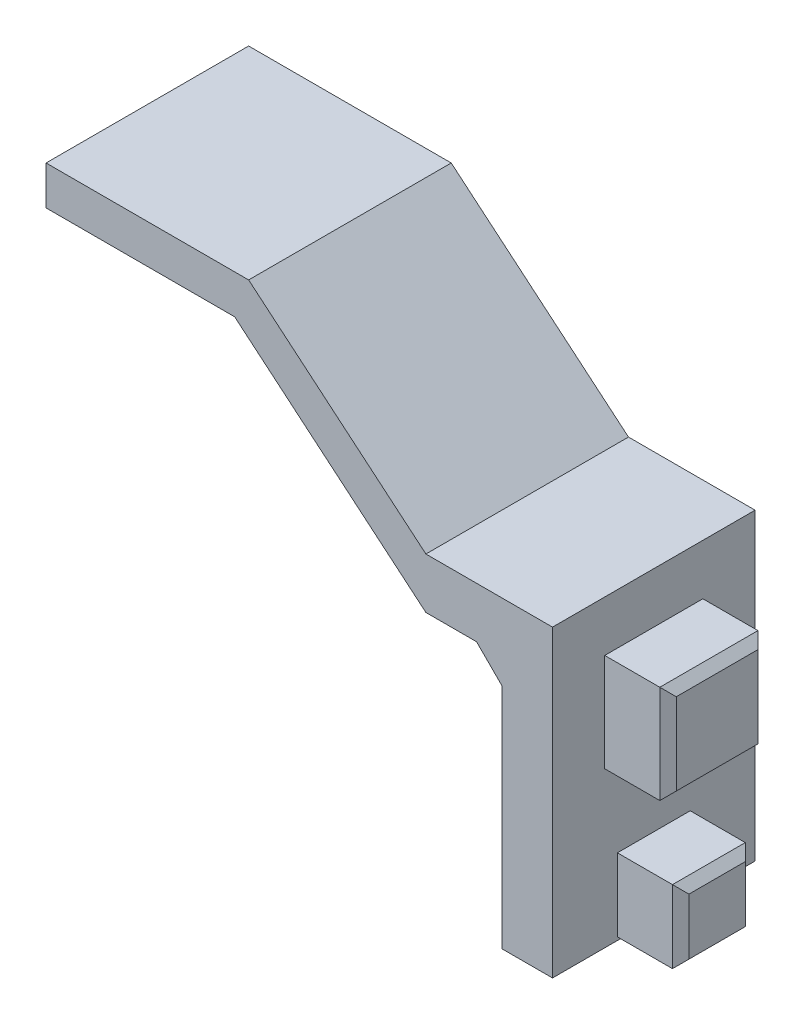
ISO-10303-21;
HEADER;
FILE_DESCRIPTION(('STEP AP214'),'2;1');
FILE_NAME('part.step','',(''),(''),'','','');
FILE_SCHEMA(('AUTOMOTIVE_DESIGN { 1 0 10303 214 1 1 1 1 }'));
ENDSEC;
DATA;
#1=APPLICATION_CONTEXT('core data for automotive mechanical design processes');
#2=APPLICATION_PROTOCOL_DEFINITION('international standard','automotive_design',2000,#1);
#3=PRODUCT_CONTEXT('',#1,'mechanical');
#4=PRODUCT('Part','Part','',(#3));
#5=PRODUCT_RELATED_PRODUCT_CATEGORY('part','',(#4));
#6=PRODUCT_DEFINITION_FORMATION('','',#4);
#7=PRODUCT_DEFINITION_CONTEXT('part definition',#1,'design');
#8=PRODUCT_DEFINITION('design','',#6,#7);
#9=PRODUCT_DEFINITION_SHAPE('','',#8);
#10=(LENGTH_UNIT() NAMED_UNIT(*) SI_UNIT(.MILLI.,.METRE.));
#11=(NAMED_UNIT(*) PLANE_ANGLE_UNIT() SI_UNIT($,.RADIAN.));
#12=(NAMED_UNIT(*) SI_UNIT($,.STERADIAN.) SOLID_ANGLE_UNIT());
#13=UNCERTAINTY_MEASURE_WITH_UNIT(LENGTH_MEASURE(1.E-05),#10,'distance_accuracy_value','');
#14=(GEOMETRIC_REPRESENTATION_CONTEXT(3) GLOBAL_UNCERTAINTY_ASSIGNED_CONTEXT((#13)) GLOBAL_UNIT_ASSIGNED_CONTEXT((#10,
#11,#12)) REPRESENTATION_CONTEXT('',''));
#15=CARTESIAN_POINT('',(0.,0.,0.));
#16=DIRECTION('',(0.,0.,1.));
#17=DIRECTION('',(1.,0.,0.));
#18=AXIS2_PLACEMENT_3D('',#15,#16,#17);
#19=CARTESIAN_POINT('',(0.,9.99999999999999,-4.));
#20=DIRECTION('',(0.,-1.,0.));
#21=DIRECTION('',(1.,0.,0.));
#22=AXIS2_PLACEMENT_3D('',#19,#20,#21);
#23=PLANE('',#22);
#24=DIRECTION('',(1.,0.,0.));
#25=VECTOR('',#24,1.);
#26=CARTESIAN_POINT('',(0.,9.99999999999999,4.));
#27=LINE('',#26,#25);
#28=CARTESIAN_POINT('',(-5.,10.,4.));
#29=VERTEX_POINT('',#28);
#30=CARTESIAN_POINT('',(-3.,10.,4.));
#31=VERTEX_POINT('',#30);
#32=EDGE_CURVE('E252',#29,#31,#27,.T.);
#33=ORIENTED_EDGE('',*,*,#32,.F.);
#34=DIRECTION('',(0.,0.,1.));
#35=VECTOR('',#34,1.);
#36=CARTESIAN_POINT('',(-5.,10.,-4.));
#37=LINE('',#36,#35);
#38=CARTESIAN_POINT('',(-5.,10.,-4.));
#39=VERTEX_POINT('',#38);
#40=EDGE_CURVE('E319',#39,#29,#37,.T.);
#41=ORIENTED_EDGE('',*,*,#40,.F.);
#42=DIRECTION('',(1.,0.,0.));
#43=VECTOR('',#42,1.);
#44=CARTESIAN_POINT('',(0.,9.99999999999999,-4.));
#45=LINE('',#44,#43);
#46=CARTESIAN_POINT('',(-3.,10.,-4.));
#47=VERTEX_POINT('',#46);
#48=EDGE_CURVE('E253',#39,#47,#45,.T.);
#49=ORIENTED_EDGE('',*,*,#48,.T.);
#50=DIRECTION('',(0.,0.,1.));
#51=VECTOR('',#50,1.);
#52=CARTESIAN_POINT('',(-3.,10.,-4.));
#53=LINE('',#52,#51);
#54=EDGE_CURVE('E287',#47,#31,#53,.T.);
#55=ORIENTED_EDGE('',*,*,#54,.T.);
#56=EDGE_LOOP('',(#33,#41,#49,#55));
#57=FACE_BOUND('',#56,.T.);
#58=ADVANCED_FACE('F38',(#57),#23,.T.);
#59=CARTESIAN_POINT('',(2.85815920922836,3.40622150580412,-4.));
#60=DIRECTION('',(-0.64278760968654,-0.766044443118977,0.));
#61=DIRECTION('',(0.766044443118977,-0.64278760968654,0.));
#62=AXIS2_PLACEMENT_3D('',#59,#60,#61);
#63=PLANE('',#62);
#64=DIRECTION('',(0.766044443118977,-0.64278760968654,0.));
#65=VECTOR('',#64,1.);
#66=CARTESIAN_POINT('',(2.85815920922836,3.40622150580412,4.));
#67=LINE('',#66,#65);
#68=CARTESIAN_POINT('',(-12.5507571417772,16.3358375327745,4.));
#69=VERTEX_POINT('',#68);
#70=EDGE_CURVE('E257',#69,#29,#67,.T.);
#71=ORIENTED_EDGE('',*,*,#70,.F.);
#72=DIRECTION('',(0.,0.,1.));
#73=VECTOR('',#72,1.);
#74=CARTESIAN_POINT('',(-12.5507571417772,16.3358375327745,-4.));
#75=LINE('',#74,#73);
#76=CARTESIAN_POINT('',(-12.5507571417772,16.3358375327745,-4.));
#77=VERTEX_POINT('',#76);
#78=EDGE_CURVE('E322',#77,#69,#75,.T.);
#79=ORIENTED_EDGE('',*,*,#78,.F.);
#80=DIRECTION('',(0.766044443118977,-0.64278760968654,0.));
#81=VECTOR('',#80,1.);
#82=CARTESIAN_POINT('',(2.85815920922836,3.40622150580412,-4.));
#83=LINE('',#82,#81);
#84=EDGE_CURVE('E284',#77,#39,#83,.T.);
#85=ORIENTED_EDGE('',*,*,#84,.T.);
#86=ORIENTED_EDGE('',*,*,#40,.T.);
#87=EDGE_LOOP('',(#71,#79,#85,#86));
#88=FACE_BOUND('',#87,.T.);
#89=ADVANCED_FACE('F424',(#88),#63,.T.);
#90=CARTESIAN_POINT('',(0.,16.3358375327745,-4.));
#91=DIRECTION('',(0.,-1.,0.));
#92=DIRECTION('',(1.,0.,0.));
#93=AXIS2_PLACEMENT_3D('',#90,#91,#92);
#94=PLANE('',#93);
#95=DIRECTION('',(1.,0.,0.));
#96=VECTOR('',#95,1.);
#97=CARTESIAN_POINT('',(0.,16.3358375327745,4.));
#98=LINE('',#97,#96);
#99=CARTESIAN_POINT('',(-20.,16.3358375327745,4.));
#100=VERTEX_POINT('',#99);
#101=EDGE_CURVE('E314',#100,#69,#98,.T.);
#102=ORIENTED_EDGE('',*,*,#101,.F.);
#103=DIRECTION('',(0.,0.,1.));
#104=VECTOR('',#103,1.);
#105=CARTESIAN_POINT('',(-20.,16.3358375327745,-4.));
#106=LINE('',#105,#104);
#107=CARTESIAN_POINT('',(-20.,16.3358375327745,-4.));
#108=VERTEX_POINT('',#107);
#109=EDGE_CURVE('E324',#108,#100,#106,.T.);
#110=ORIENTED_EDGE('',*,*,#109,.F.);
#111=DIRECTION('',(1.,0.,0.));
#112=VECTOR('',#111,1.);
#113=CARTESIAN_POINT('',(0.,16.3358375327745,-4.));
#114=LINE('',#113,#112);
#115=EDGE_CURVE('E281',#108,#77,#114,.T.);
#116=ORIENTED_EDGE('',*,*,#115,.T.);
#117=ORIENTED_EDGE('',*,*,#78,.T.);
#118=EDGE_LOOP('',(#102,#110,#116,#117));
#119=FACE_BOUND('',#118,.T.);
#120=ADVANCED_FACE('F430',(#119),#94,.T.);
#121=CARTESIAN_POINT('',(-20.,0.,-4.));
#122=DIRECTION('',(-1.,0.,0.));
#123=DIRECTION('',(0.,-1.,0.));
#124=AXIS2_PLACEMENT_3D('',#121,#122,#123);
#125=PLANE('',#124);
#126=DIRECTION('',(0.,-1.,0.));
#127=VECTOR('',#126,1.);
#128=CARTESIAN_POINT('',(-20.,0.,4.));
#129=LINE('',#128,#127);
#130=CARTESIAN_POINT('',(-20.,17.873697418241,4.));
#131=VERTEX_POINT('',#130);
#132=EDGE_CURVE('E311',#131,#100,#129,.T.);
#133=ORIENTED_EDGE('',*,*,#132,.F.);
#134=DIRECTION('',(0.,0.,1.));
#135=VECTOR('',#134,1.);
#136=CARTESIAN_POINT('',(-20.,17.873697418241,-4.));
#137=LINE('',#136,#135);
#138=CARTESIAN_POINT('',(-20.,17.873697418241,-4.));
#139=VERTEX_POINT('',#138);
#140=EDGE_CURVE('E326',#139,#131,#137,.T.);
#141=ORIENTED_EDGE('',*,*,#140,.F.);
#142=DIRECTION('',(0.,-1.,0.));
#143=VECTOR('',#142,1.);
#144=CARTESIAN_POINT('',(-20.,0.,-4.));
#145=LINE('',#144,#143);
#146=EDGE_CURVE('E278',#139,#108,#145,.T.);
#147=ORIENTED_EDGE('',*,*,#146,.T.);
#148=ORIENTED_EDGE('',*,*,#109,.T.);
#149=EDGE_LOOP('',(#133,#141,#147,#148));
#150=FACE_BOUND('',#149,.T.);
#151=ADVANCED_FACE('F648',(#150),#125,.T.);
#152=CARTESIAN_POINT('',(0.,17.873697418241,-4.));
#153=DIRECTION('',(0.,1.,0.));
#154=DIRECTION('',(0.,0.,1.));
#155=AXIS2_PLACEMENT_3D('',#152,#153,#154);
#156=PLANE('',#155);
#157=DIRECTION('',(-1.,0.,0.));
#158=VECTOR('',#157,1.);
#159=CARTESIAN_POINT('',(0.,17.873697418241,4.));
#160=LINE('',#159,#158);
#161=CARTESIAN_POINT('',(-12.,17.873697418241,4.));
#162=VERTEX_POINT('',#161);
#163=EDGE_CURVE('E308',#162,#131,#160,.T.);
#164=ORIENTED_EDGE('',*,*,#163,.F.);
#165=DIRECTION('',(0.,0.,1.));
#166=VECTOR('',#165,1.);
#167=CARTESIAN_POINT('',(-12.,17.873697418241,-4.));
#168=LINE('',#167,#166);
#169=CARTESIAN_POINT('',(-12.,17.873697418241,-4.));
#170=VERTEX_POINT('',#169);
#171=EDGE_CURVE('E328',#170,#162,#168,.T.);
#172=ORIENTED_EDGE('',*,*,#171,.F.);
#173=DIRECTION('',(-1.,0.,0.));
#174=VECTOR('',#173,1.);
#175=CARTESIAN_POINT('',(0.,17.873697418241,-4.));
#176=LINE('',#175,#174);
#177=EDGE_CURVE('E275',#170,#139,#176,.T.);
#178=ORIENTED_EDGE('',*,*,#177,.T.);
#179=ORIENTED_EDGE('',*,*,#140,.T.);
#180=EDGE_LOOP('',(#164,#172,#178,#179));
#181=FACE_BOUND('',#180,.T.);
#182=ADVANCED_FACE('F638',(#181),#156,.T.);
#183=CARTESIAN_POINT('',(3.84296696224057,4.57986968347105,-4.));
#184=DIRECTION('',(0.64278760968654,0.766044443118977,0.));
#185=DIRECTION('',(-0.766044443118977,0.64278760968654,0.));
#186=AXIS2_PLACEMENT_3D('',#183,#184,#185);
#187=PLANE('',#186);
#188=DIRECTION('',(-0.766044443118977,0.64278760968654,0.));
#189=VECTOR('',#188,1.);
#190=CARTESIAN_POINT('',(3.84296696224057,4.57986968347105,4.));
#191=LINE('',#190,#189);
#192=CARTESIAN_POINT('',(-5.,12.,4.));
#193=VERTEX_POINT('',#192);
#194=EDGE_CURVE('E305',#193,#162,#191,.T.);
#195=ORIENTED_EDGE('',*,*,#194,.F.);
#196=DIRECTION('',(0.,0.,1.));
#197=VECTOR('',#196,1.);
#198=CARTESIAN_POINT('',(-5.,12.,-4.));
#199=LINE('',#198,#197);
#200=CARTESIAN_POINT('',(-5.,12.,-4.));
#201=VERTEX_POINT('',#200);
#202=EDGE_CURVE('E330',#201,#193,#199,.T.);
#203=ORIENTED_EDGE('',*,*,#202,.F.);
#204=DIRECTION('',(-0.766044443118977,0.64278760968654,0.));
#205=VECTOR('',#204,1.);
#206=CARTESIAN_POINT('',(3.84296696224057,4.57986968347105,-4.));
#207=LINE('',#206,#205);
#208=EDGE_CURVE('E272',#201,#170,#207,.T.);
#209=ORIENTED_EDGE('',*,*,#208,.T.);
#210=ORIENTED_EDGE('',*,*,#171,.T.);
#211=EDGE_LOOP('',(#195,#203,#209,#210));
#212=FACE_BOUND('',#211,.T.);
#213=ADVANCED_FACE('F628',(#212),#187,.T.);
#214=CARTESIAN_POINT('',(0.,12.,-4.));
#215=DIRECTION('',(0.,1.,0.));
#216=DIRECTION('',(0.,0.,1.));
#217=AXIS2_PLACEMENT_3D('',#214,#215,#216);
#218=PLANE('',#217);
#219=DIRECTION('',(-1.,0.,0.));
#220=VECTOR('',#219,1.);
#221=CARTESIAN_POINT('',(0.,12.,4.));
#222=LINE('',#221,#220);
#223=CARTESIAN_POINT('',(0.,12.,4.));
#224=VERTEX_POINT('',#223);
#225=EDGE_CURVE('E302',#224,#193,#222,.T.);
#226=ORIENTED_EDGE('',*,*,#225,.F.);
#227=DIRECTION('',(0.,0.,1.));
#228=VECTOR('',#227,1.);
#229=CARTESIAN_POINT('',(0.,12.,-4.));
#230=LINE('',#229,#228);
#231=CARTESIAN_POINT('',(0.,12.,-4.));
#232=VERTEX_POINT('',#231);
#233=EDGE_CURVE('E332',#232,#224,#230,.T.);
#234=ORIENTED_EDGE('',*,*,#233,.F.);
#235=DIRECTION('',(-1.,0.,0.));
#236=VECTOR('',#235,1.);
#237=CARTESIAN_POINT('',(0.,12.,-4.));
#238=LINE('',#237,#236);
#239=EDGE_CURVE('E269',#232,#201,#238,.T.);
#240=ORIENTED_EDGE('',*,*,#239,.T.);
#241=ORIENTED_EDGE('',*,*,#202,.T.);
#242=EDGE_LOOP('',(#226,#234,#240,#241));
#243=FACE_BOUND('',#242,.T.);
#244=ADVANCED_FACE('F574',(#243),#218,.T.);
#245=CARTESIAN_POINT('',(0.,0.,-4.));
#246=DIRECTION('',(1.,0.,0.));
#247=DIRECTION('',(0.,0.,-1.));
#248=AXIS2_PLACEMENT_3D('',#245,#246,#247);
#249=PLANE('',#248);
#250=DIRECTION('',(0.,1.,0.));
#251=VECTOR('',#250,1.);
#252=CARTESIAN_POINT('',(0.,0.,1.4375));
#253=LINE('',#252,#251);
#254=CARTESIAN_POINT('',(0.,0.124999999999999,1.4375));
#255=VERTEX_POINT('',#254);
#256=CARTESIAN_POINT('',(0.,3.,1.4375));
#257=VERTEX_POINT('',#256);
#258=EDGE_CURVE('E215',#255,#257,#253,.T.);
#259=ORIENTED_EDGE('',*,*,#258,.T.);
#260=DIRECTION('',(0.,0.,-1.));
#261=VECTOR('',#260,1.);
#262=CARTESIAN_POINT('',(0.,3.,1.4375));
#263=LINE('',#262,#261);
#264=CARTESIAN_POINT('',(0.,3.,-1.4375));
#265=VERTEX_POINT('',#264);
#266=EDGE_CURVE('E197',#257,#265,#263,.T.);
#267=ORIENTED_EDGE('',*,*,#266,.T.);
#268=DIRECTION('',(0.,1.,0.));
#269=VECTOR('',#268,1.);
#270=CARTESIAN_POINT('',(0.,0.,-1.4375));
#271=LINE('',#270,#269);
#272=CARTESIAN_POINT('',(0.,0.124999999999999,-1.4375));
#273=VERTEX_POINT('',#272);
#274=EDGE_CURVE('E232',#273,#265,#271,.T.);
#275=ORIENTED_EDGE('',*,*,#274,.F.);
#276=DIRECTION('',(0.,0.,-1.));
#277=VECTOR('',#276,1.);
#278=CARTESIAN_POINT('',(0.,0.124999999999999,1.4375));
#279=LINE('',#278,#277);
#280=EDGE_CURVE('E209',#255,#273,#279,.T.);
#281=ORIENTED_EDGE('',*,*,#280,.F.);
#282=EDGE_LOOP('',(#259,#267,#275,#281));
#283=FACE_BOUND('',#282,.T.);
#284=DIRECTION('',(0.,1.,0.));
#285=VECTOR('',#284,1.);
#286=CARTESIAN_POINT('',(0.,0.,-1.9375));
#287=LINE('',#286,#285);
#288=CARTESIAN_POINT('',(0.,6.125,-1.9375));
#289=VERTEX_POINT('',#288);
#290=CARTESIAN_POINT('',(0.,10.,-1.9375));
#291=VERTEX_POINT('',#290);
#292=EDGE_CURVE('E237',#289,#291,#287,.T.);
#293=ORIENTED_EDGE('',*,*,#292,.F.);
#294=DIRECTION('',(0.,0.,-1.));
#295=VECTOR('',#294,1.);
#296=CARTESIAN_POINT('',(0.,6.125,1.9375));
#297=LINE('',#296,#295);
#298=CARTESIAN_POINT('',(0.,6.125,1.9375));
#299=VERTEX_POINT('',#298);
#300=EDGE_CURVE('E242',#299,#289,#297,.T.);
#301=ORIENTED_EDGE('',*,*,#300,.F.);
#302=DIRECTION('',(0.,1.,0.));
#303=VECTOR('',#302,1.);
#304=CARTESIAN_POINT('',(0.,0.,1.9375));
#305=LINE('',#304,#303);
#306=CARTESIAN_POINT('',(0.,10.,1.9375));
#307=VERTEX_POINT('',#306);
#308=EDGE_CURVE('E239',#299,#307,#305,.T.);
#309=ORIENTED_EDGE('',*,*,#308,.T.);
#310=DIRECTION('',(0.,0.,-1.));
#311=VECTOR('',#310,1.);
#312=CARTESIAN_POINT('',(0.,10.,1.9375));
#313=LINE('',#312,#311);
#314=EDGE_CURVE('E249',#307,#291,#313,.T.);
#315=ORIENTED_EDGE('',*,*,#314,.T.);
#316=EDGE_LOOP('',(#293,#301,#309,#315));
#317=FACE_BOUND('',#316,.T.);
#318=DIRECTION('',(0.,1.,0.));
#319=VECTOR('',#318,1.);
#320=CARTESIAN_POINT('',(0.,0.,4.));
#321=LINE('',#320,#319);
#322=CARTESIAN_POINT('',(0.,0.,4.));
#323=VERTEX_POINT('',#322);
#324=EDGE_CURVE('E299',#323,#224,#321,.T.);
#325=ORIENTED_EDGE('',*,*,#324,.F.);
#326=DIRECTION('',(0.,0.,1.));
#327=VECTOR('',#326,1.);
#328=CARTESIAN_POINT('',(0.,0.,-4.));
#329=LINE('',#328,#327);
#330=CARTESIAN_POINT('',(0.,0.,-4.));
#331=VERTEX_POINT('',#330);
#332=EDGE_CURVE('E334',#331,#323,#329,.T.);
#333=ORIENTED_EDGE('',*,*,#332,.F.);
#334=DIRECTION('',(0.,1.,0.));
#335=VECTOR('',#334,1.);
#336=CARTESIAN_POINT('',(0.,0.,-4.));
#337=LINE('',#336,#335);
#338=EDGE_CURVE('E266',#331,#232,#337,.T.);
#339=ORIENTED_EDGE('',*,*,#338,.T.);
#340=ORIENTED_EDGE('',*,*,#233,.T.);
#341=EDGE_LOOP('',(#325,#333,#339,#340));
#342=FACE_BOUND('',#341,.T.);
#343=ADVANCED_FACE('F221',(#283,#317,#342),#249,.T.);
#344=CARTESIAN_POINT('',(0.,0.,-4.));
#345=DIRECTION('',(0.,-1.,0.));
#346=DIRECTION('',(0.,0.,-1.));
#347=AXIS2_PLACEMENT_3D('',#344,#345,#346);
#348=PLANE('',#347);
#349=DIRECTION('',(1.,0.,0.));
#350=VECTOR('',#349,1.);
#351=CARTESIAN_POINT('',(0.,0.,4.));
#352=LINE('',#351,#350);
#353=CARTESIAN_POINT('',(-2.,0.,4.));
#354=VERTEX_POINT('',#353);
#355=EDGE_CURVE('E296',#354,#323,#352,.T.);
#356=ORIENTED_EDGE('',*,*,#355,.F.);
#357=DIRECTION('',(0.,0.,1.));
#358=VECTOR('',#357,1.);
#359=CARTESIAN_POINT('',(-2.,0.,-4.));
#360=LINE('',#359,#358);
#361=CARTESIAN_POINT('',(-2.,0.,-4.));
#362=VERTEX_POINT('',#361);
#363=EDGE_CURVE('E336',#362,#354,#360,.T.);
#364=ORIENTED_EDGE('',*,*,#363,.F.);
#365=DIRECTION('',(1.,0.,0.));
#366=VECTOR('',#365,1.);
#367=CARTESIAN_POINT('',(0.,0.,-4.));
#368=LINE('',#367,#366);
#369=EDGE_CURVE('E263',#362,#331,#368,.T.);
#370=ORIENTED_EDGE('',*,*,#369,.T.);
#371=ORIENTED_EDGE('',*,*,#332,.T.);
#372=EDGE_LOOP('',(#356,#364,#370,#371));
#373=FACE_BOUND('',#372,.T.);
#374=ADVANCED_FACE('F573',(#373),#348,.T.);
#375=CARTESIAN_POINT('',(-2.,0.,-4.));
#376=DIRECTION('',(-1.,0.,0.));
#377=DIRECTION('',(0.,-1.,0.));
#378=AXIS2_PLACEMENT_3D('',#375,#376,#377);
#379=PLANE('',#378);
#380=DIRECTION('',(0.,-1.,0.));
#381=VECTOR('',#380,1.);
#382=CARTESIAN_POINT('',(-2.,0.,4.));
#383=LINE('',#382,#381);
#384=CARTESIAN_POINT('',(-2.,9.,4.));
#385=VERTEX_POINT('',#384);
#386=EDGE_CURVE('E293',#385,#354,#383,.T.);
#387=ORIENTED_EDGE('',*,*,#386,.F.);
#388=DIRECTION('',(0.,0.,1.));
#389=VECTOR('',#388,1.);
#390=CARTESIAN_POINT('',(-2.,9.,-4.));
#391=LINE('',#390,#389);
#392=CARTESIAN_POINT('',(-2.,9.,-4.));
#393=VERTEX_POINT('',#392);
#394=EDGE_CURVE('E338',#393,#385,#391,.T.);
#395=ORIENTED_EDGE('',*,*,#394,.F.);
#396=DIRECTION('',(0.,-1.,0.));
#397=VECTOR('',#396,1.);
#398=CARTESIAN_POINT('',(-2.,0.,-4.));
#399=LINE('',#398,#397);
#400=EDGE_CURVE('E260',#393,#362,#399,.T.);
#401=ORIENTED_EDGE('',*,*,#400,.T.);
#402=ORIENTED_EDGE('',*,*,#363,.T.);
#403=EDGE_LOOP('',(#387,#395,#401,#402));
#404=FACE_BOUND('',#403,.T.);
#405=ADVANCED_FACE('F606',(#404),#379,.T.);
#406=CARTESIAN_POINT('',(3.5,3.5,-4.));
#407=DIRECTION('',(-0.707106781186548,-0.707106781186547,0.));
#408=DIRECTION('',(0.707106781186547,-0.707106781186548,0.));
#409=AXIS2_PLACEMENT_3D('',#406,#407,#408);
#410=PLANE('',#409);
#411=DIRECTION('',(0.707106781186547,-0.707106781186548,0.));
#412=VECTOR('',#411,1.);
#413=CARTESIAN_POINT('',(3.5,3.5,4.));
#414=LINE('',#413,#412);
#415=EDGE_CURVE('E290',#31,#385,#414,.T.);
#416=ORIENTED_EDGE('',*,*,#415,.F.);
#417=ORIENTED_EDGE('',*,*,#54,.F.);
#418=DIRECTION('',(0.707106781186547,-0.707106781186548,0.));
#419=VECTOR('',#418,1.);
#420=CARTESIAN_POINT('',(3.5,3.5,-4.));
#421=LINE('',#420,#419);
#422=EDGE_CURVE('E256',#47,#393,#421,.T.);
#423=ORIENTED_EDGE('',*,*,#422,.T.);
#424=ORIENTED_EDGE('',*,*,#394,.T.);
#425=EDGE_LOOP('',(#416,#417,#423,#424));
#426=FACE_BOUND('',#425,.T.);
#427=ADVANCED_FACE('F436',(#426),#410,.T.);
#428=CARTESIAN_POINT('',(0.,0.,-4.));
#429=DIRECTION('',(0.,0.,1.));
#430=DIRECTION('',(1.,0.,0.));
#431=AXIS2_PLACEMENT_3D('',#428,#429,#430);
#432=PLANE('',#431);
#433=ORIENTED_EDGE('',*,*,#48,.F.);
#434=ORIENTED_EDGE('',*,*,#84,.F.);
#435=ORIENTED_EDGE('',*,*,#115,.F.);
#436=ORIENTED_EDGE('',*,*,#146,.F.);
#437=ORIENTED_EDGE('',*,*,#177,.F.);
#438=ORIENTED_EDGE('',*,*,#208,.F.);
#439=ORIENTED_EDGE('',*,*,#239,.F.);
#440=ORIENTED_EDGE('',*,*,#338,.F.);
#441=ORIENTED_EDGE('',*,*,#369,.F.);
#442=ORIENTED_EDGE('',*,*,#400,.F.);
#443=ORIENTED_EDGE('',*,*,#422,.F.);
#444=EDGE_LOOP('',(#433,#434,#435,#436,#437,#438,#439,#440,#441,#442,#443));
#445=FACE_BOUND('',#444,.T.);
#446=ADVANCED_FACE('F585',(#445),#432,.F.);
#447=CARTESIAN_POINT('',(0.,0.,4.));
#448=DIRECTION('',(0.,0.,1.));
#449=DIRECTION('',(1.,0.,0.));
#450=AXIS2_PLACEMENT_3D('',#447,#448,#449);
#451=PLANE('',#450);
#452=ORIENTED_EDGE('',*,*,#32,.T.);
#453=ORIENTED_EDGE('',*,*,#415,.T.);
#454=ORIENTED_EDGE('',*,*,#386,.T.);
#455=ORIENTED_EDGE('',*,*,#355,.T.);
#456=ORIENTED_EDGE('',*,*,#324,.T.);
#457=ORIENTED_EDGE('',*,*,#225,.T.);
#458=ORIENTED_EDGE('',*,*,#194,.T.);
#459=ORIENTED_EDGE('',*,*,#163,.T.);
#460=ORIENTED_EDGE('',*,*,#132,.T.);
#461=ORIENTED_EDGE('',*,*,#101,.T.);
#462=ORIENTED_EDGE('',*,*,#70,.T.);
#463=EDGE_LOOP('',(#452,#453,#454,#455,#456,#457,#458,#459,#460,#461,#462));
#464=FACE_BOUND('',#463,.T.);
#465=ADVANCED_FACE('F421',(#464),#451,.T.);
#466=CARTESIAN_POINT('',(0.,6.125,1.9375));
#467=DIRECTION('',(0.,-1.,0.));
#468=DIRECTION('',(0.,0.,-1.));
#469=AXIS2_PLACEMENT_3D('',#466,#467,#468);
#470=PLANE('',#469);
#471=DIRECTION('',(-1.,0.,0.));
#472=VECTOR('',#471,1.);
#473=CARTESIAN_POINT('',(0.,6.125,-1.9375));
#474=LINE('',#473,#472);
#475=CARTESIAN_POINT('',(2.17499999999999,6.125,-1.9375));
#476=VERTEX_POINT('',#475);
#477=EDGE_CURVE('E208',#476,#289,#474,.T.);
#478=ORIENTED_EDGE('',*,*,#477,.F.);
#479=DIRECTION('',(0.,0.,1.));
#480=VECTOR('',#479,1.);
#481=CARTESIAN_POINT('',(2.17499999999999,6.125,1.9375));
#482=LINE('',#481,#480);
#483=CARTESIAN_POINT('',(2.17499999999999,6.125,1.9375));
#484=VERTEX_POINT('',#483);
#485=EDGE_CURVE('E366',#476,#484,#482,.T.);
#486=ORIENTED_EDGE('',*,*,#485,.T.);
#487=DIRECTION('',(-1.,0.,0.));
#488=VECTOR('',#487,1.);
#489=CARTESIAN_POINT('',(0.,6.125,1.9375));
#490=LINE('',#489,#488);
#491=EDGE_CURVE('E234',#484,#299,#490,.T.);
#492=ORIENTED_EDGE('',*,*,#491,.T.);
#493=ORIENTED_EDGE('',*,*,#300,.T.);
#494=EDGE_LOOP('',(#478,#486,#492,#493));
#495=FACE_BOUND('',#494,.T.);
#496=ADVANCED_FACE('F404',(#495),#470,.T.);
#497=CARTESIAN_POINT('',(2.5,0.,1.9375));
#498=DIRECTION('',(1.,0.,0.));
#499=DIRECTION('',(0.,1.,0.));
#500=AXIS2_PLACEMENT_3D('',#497,#498,#499);
#501=PLANE('',#500);
#502=DIRECTION('',(0.,-1.,0.));
#503=VECTOR('',#502,1.);
#504=CARTESIAN_POINT('',(2.5,0.,1.61249999999999));
#505=LINE('',#504,#503);
#506=CARTESIAN_POINT('',(2.5,9.67499999999999,1.61249999999999));
#507=VERTEX_POINT('',#506);
#508=CARTESIAN_POINT('',(2.5,6.45000000000001,1.61249999999999));
#509=VERTEX_POINT('',#508);
#510=EDGE_CURVE('E361',#507,#509,#505,.T.);
#511=ORIENTED_EDGE('',*,*,#510,.T.);
#512=DIRECTION('',(0.,0.,-1.));
#513=VECTOR('',#512,1.);
#514=CARTESIAN_POINT('',(2.5,6.45000000000001,1.9375));
#515=LINE('',#514,#513);
#516=CARTESIAN_POINT('',(2.5,6.45000000000001,-1.61249999999999));
#517=VERTEX_POINT('',#516);
#518=EDGE_CURVE('E363',#509,#517,#515,.T.);
#519=ORIENTED_EDGE('',*,*,#518,.T.);
#520=DIRECTION('',(0.,1.,0.));
#521=VECTOR('',#520,1.);
#522=CARTESIAN_POINT('',(2.5,10.,-1.61249999999999));
#523=LINE('',#522,#521);
#524=CARTESIAN_POINT('',(2.5,9.67499999999999,-1.61249999999999));
#525=VERTEX_POINT('',#524);
#526=EDGE_CURVE('E357',#517,#525,#523,.T.);
#527=ORIENTED_EDGE('',*,*,#526,.T.);
#528=DIRECTION('',(0.,0.,1.));
#529=VECTOR('',#528,1.);
#530=CARTESIAN_POINT('',(2.5,9.67499999999999,1.9375));
#531=LINE('',#530,#529);
#532=EDGE_CURVE('E359',#525,#507,#531,.T.);
#533=ORIENTED_EDGE('',*,*,#532,.T.);
#534=EDGE_LOOP('',(#511,#519,#527,#533));
#535=FACE_BOUND('',#534,.T.);
#536=ADVANCED_FACE('F411',(#535),#501,.T.);
#537=CARTESIAN_POINT('',(0.,10.,1.9375));
#538=DIRECTION('',(0.,1.,0.));
#539=DIRECTION('',(0.,0.,1.));
#540=AXIS2_PLACEMENT_3D('',#537,#538,#539);
#541=PLANE('',#540);
#542=DIRECTION('',(1.,0.,0.));
#543=VECTOR('',#542,1.);
#544=CARTESIAN_POINT('',(0.,10.,1.9375));
#545=LINE('',#544,#543);
#546=CARTESIAN_POINT('',(2.17499999999999,10.,1.9375));
#547=VERTEX_POINT('',#546);
#548=EDGE_CURVE('E236',#307,#547,#545,.T.);
#549=ORIENTED_EDGE('',*,*,#548,.T.);
#550=DIRECTION('',(0.,0.,-1.));
#551=VECTOR('',#550,1.);
#552=CARTESIAN_POINT('',(2.17499999999999,10.,1.9375));
#553=LINE('',#552,#551);
#554=CARTESIAN_POINT('',(2.17499999999999,10.,-1.9375));
#555=VERTEX_POINT('',#554);
#556=EDGE_CURVE('E48',#547,#555,#553,.T.);
#557=ORIENTED_EDGE('',*,*,#556,.T.);
#558=DIRECTION('',(1.,0.,0.));
#559=VECTOR('',#558,1.);
#560=CARTESIAN_POINT('',(0.,10.,-1.9375));
#561=LINE('',#560,#559);
#562=EDGE_CURVE('E244',#291,#555,#561,.T.);
#563=ORIENTED_EDGE('',*,*,#562,.F.);
#564=ORIENTED_EDGE('',*,*,#314,.F.);
#565=EDGE_LOOP('',(#549,#557,#563,#564));
#566=FACE_BOUND('',#565,.T.);
#567=ADVANCED_FACE('F413',(#566),#541,.T.);
#568=CARTESIAN_POINT('',(0.,0.,1.9375));
#569=DIRECTION('',(0.,0.,1.));
#570=DIRECTION('',(1.,0.,0.));
#571=AXIS2_PLACEMENT_3D('',#568,#569,#570);
#572=PLANE('',#571);
#573=ORIENTED_EDGE('',*,*,#491,.F.);
#574=DIRECTION('',(0.,1.,0.));
#575=VECTOR('',#574,1.);
#576=CARTESIAN_POINT('',(2.175,0.,1.9375));
#577=LINE('',#576,#575);
#578=EDGE_CURVE('E63',#484,#547,#577,.T.);
#579=ORIENTED_EDGE('',*,*,#578,.T.);
#580=ORIENTED_EDGE('',*,*,#548,.F.);
#581=ORIENTED_EDGE('',*,*,#308,.F.);
#582=EDGE_LOOP('',(#573,#579,#580,#581));
#583=FACE_BOUND('',#582,.T.);
#584=ADVANCED_FACE('F419',(#583),#572,.T.);
#585=CARTESIAN_POINT('',(0.,0.,-1.9375));
#586=DIRECTION('',(0.,0.,1.));
#587=DIRECTION('',(1.,0.,0.));
#588=AXIS2_PLACEMENT_3D('',#585,#586,#587);
#589=PLANE('',#588);
#590=ORIENTED_EDGE('',*,*,#562,.T.);
#591=DIRECTION('',(0.,-1.,0.));
#592=VECTOR('',#591,1.);
#593=CARTESIAN_POINT('',(2.17499999999999,6.125,-1.9375));
#594=LINE('',#593,#592);
#595=EDGE_CURVE('E11',#555,#476,#594,.T.);
#596=ORIENTED_EDGE('',*,*,#595,.T.);
#597=ORIENTED_EDGE('',*,*,#477,.T.);
#598=ORIENTED_EDGE('',*,*,#292,.T.);
#599=EDGE_LOOP('',(#590,#596,#597,#598));
#600=FACE_BOUND('',#599,.T.);
#601=ADVANCED_FACE('F401',(#600),#589,.F.);
#602=CARTESIAN_POINT('',(0.,0.124999999999999,1.4375));
#603=DIRECTION('',(0.,-1.,0.));
#604=DIRECTION('',(1.,0.,0.));
#605=AXIS2_PLACEMENT_3D('',#602,#603,#604);
#606=PLANE('',#605);
#607=DIRECTION('',(-1.,0.,0.));
#608=VECTOR('',#607,1.);
#609=CARTESIAN_POINT('',(0.,0.124999999999999,-1.4375));
#610=LINE('',#609,#608);
#611=CARTESIAN_POINT('',(2.175,0.124999999999999,-1.4375));
#612=VERTEX_POINT('',#611);
#613=EDGE_CURVE('E228',#612,#273,#610,.T.);
#614=ORIENTED_EDGE('',*,*,#613,.F.);
#615=DIRECTION('',(0.,0.,1.));
#616=VECTOR('',#615,1.);
#617=CARTESIAN_POINT('',(2.175,0.124999999999999,1.4375));
#618=LINE('',#617,#616);
#619=CARTESIAN_POINT('',(2.175,0.124999999999999,1.4375));
#620=VERTEX_POINT('',#619);
#621=EDGE_CURVE('E349',#612,#620,#618,.T.);
#622=ORIENTED_EDGE('',*,*,#621,.T.);
#623=DIRECTION('',(-1.,0.,0.));
#624=VECTOR('',#623,1.);
#625=CARTESIAN_POINT('',(0.,0.124999999999999,1.4375));
#626=LINE('',#625,#624);
#627=EDGE_CURVE('E219',#620,#255,#626,.T.);
#628=ORIENTED_EDGE('',*,*,#627,.T.);
#629=ORIENTED_EDGE('',*,*,#280,.T.);
#630=EDGE_LOOP('',(#614,#622,#628,#629));
#631=FACE_BOUND('',#630,.T.);
#632=ADVANCED_FACE('F527',(#631),#606,.T.);
#633=CARTESIAN_POINT('',(2.5,0.,1.4375));
#634=DIRECTION('',(1.,0.,0.));
#635=DIRECTION('',(0.,1.,0.));
#636=AXIS2_PLACEMENT_3D('',#633,#634,#635);
#637=PLANE('',#636);
#638=DIRECTION('',(0.,-1.,0.));
#639=VECTOR('',#638,1.);
#640=CARTESIAN_POINT('',(2.5,0.,1.11249999999999));
#641=LINE('',#640,#639);
#642=CARTESIAN_POINT('',(2.5,2.67499999999999,1.11249999999999));
#643=VERTEX_POINT('',#642);
#644=CARTESIAN_POINT('',(2.5,0.450000000000005,1.11249999999999));
#645=VERTEX_POINT('',#644);
#646=EDGE_CURVE('E344',#643,#645,#641,.T.);
#647=ORIENTED_EDGE('',*,*,#646,.T.);
#648=DIRECTION('',(0.,0.,-1.));
#649=VECTOR('',#648,1.);
#650=CARTESIAN_POINT('',(2.5,0.450000000000005,1.4375));
#651=LINE('',#650,#649);
#652=CARTESIAN_POINT('',(2.5,0.450000000000005,-1.11249999999999));
#653=VERTEX_POINT('',#652);
#654=EDGE_CURVE('E346',#645,#653,#651,.T.);
#655=ORIENTED_EDGE('',*,*,#654,.T.);
#656=DIRECTION('',(0.,1.,0.));
#657=VECTOR('',#656,1.);
#658=CARTESIAN_POINT('',(2.5,3.,-1.11249999999999));
#659=LINE('',#658,#657);
#660=CARTESIAN_POINT('',(2.5,2.67499999999999,-1.11249999999999));
#661=VERTEX_POINT('',#660);
#662=EDGE_CURVE('E321',#653,#661,#659,.T.);
#663=ORIENTED_EDGE('',*,*,#662,.T.);
#664=DIRECTION('',(0.,0.,1.));
#665=VECTOR('',#664,1.);
#666=CARTESIAN_POINT('',(2.5,2.67499999999999,1.4375));
#667=LINE('',#666,#665);
#668=EDGE_CURVE('E342',#661,#643,#667,.T.);
#669=ORIENTED_EDGE('',*,*,#668,.T.);
#670=EDGE_LOOP('',(#647,#655,#663,#669));
#671=FACE_BOUND('',#670,.T.);
#672=ADVANCED_FACE('F520',(#671),#637,.T.);
#673=CARTESIAN_POINT('',(0.,3.,1.4375));
#674=DIRECTION('',(0.,1.,0.));
#675=DIRECTION('',(0.,0.,1.));
#676=AXIS2_PLACEMENT_3D('',#673,#674,#675);
#677=PLANE('',#676);
#678=DIRECTION('',(1.,0.,0.));
#679=VECTOR('',#678,1.);
#680=CARTESIAN_POINT('',(0.,3.,1.4375));
#681=LINE('',#680,#679);
#682=CARTESIAN_POINT('',(2.175,3.,1.4375));
#683=VERTEX_POINT('',#682);
#684=EDGE_CURVE('E200',#257,#683,#681,.T.);
#685=ORIENTED_EDGE('',*,*,#684,.T.);
#686=DIRECTION('',(0.,0.,-1.));
#687=VECTOR('',#686,1.);
#688=CARTESIAN_POINT('',(2.175,3.,1.4375));
#689=LINE('',#688,#687);
#690=CARTESIAN_POINT('',(2.175,3.,-1.4375));
#691=VERTEX_POINT('',#690);
#692=EDGE_CURVE('E353',#683,#691,#689,.T.);
#693=ORIENTED_EDGE('',*,*,#692,.T.);
#694=DIRECTION('',(1.,0.,0.));
#695=VECTOR('',#694,1.);
#696=CARTESIAN_POINT('',(0.,3.,-1.4375));
#697=LINE('',#696,#695);
#698=EDGE_CURVE('E203',#265,#691,#697,.T.);
#699=ORIENTED_EDGE('',*,*,#698,.F.);
#700=ORIENTED_EDGE('',*,*,#266,.F.);
#701=EDGE_LOOP('',(#685,#693,#699,#700));
#702=FACE_BOUND('',#701,.T.);
#703=ADVANCED_FACE('F199',(#702),#677,.T.);
#704=CARTESIAN_POINT('',(0.,0.,1.4375));
#705=DIRECTION('',(0.,0.,1.));
#706=DIRECTION('',(1.,0.,0.));
#707=AXIS2_PLACEMENT_3D('',#704,#705,#706);
#708=PLANE('',#707);
#709=ORIENTED_EDGE('',*,*,#627,.F.);
#710=DIRECTION('',(0.,1.,0.));
#711=VECTOR('',#710,1.);
#712=CARTESIAN_POINT('',(2.175,0.,1.4375));
#713=LINE('',#712,#711);
#714=EDGE_CURVE('E218',#620,#683,#713,.T.);
#715=ORIENTED_EDGE('',*,*,#714,.T.);
#716=ORIENTED_EDGE('',*,*,#684,.F.);
#717=ORIENTED_EDGE('',*,*,#258,.F.);
#718=EDGE_LOOP('',(#709,#715,#716,#717));
#719=FACE_BOUND('',#718,.T.);
#720=ADVANCED_FACE('F214',(#719),#708,.T.);
#721=CARTESIAN_POINT('',(0.,0.,-1.4375));
#722=DIRECTION('',(0.,0.,1.));
#723=DIRECTION('',(1.,0.,0.));
#724=AXIS2_PLACEMENT_3D('',#721,#722,#723);
#725=PLANE('',#724);
#726=ORIENTED_EDGE('',*,*,#698,.T.);
#727=DIRECTION('',(0.,-1.,0.));
#728=VECTOR('',#727,1.);
#729=CARTESIAN_POINT('',(2.175,0.124999999999999,-1.4375));
#730=LINE('',#729,#728);
#731=EDGE_CURVE('E355',#691,#612,#730,.T.);
#732=ORIENTED_EDGE('',*,*,#731,.T.);
#733=ORIENTED_EDGE('',*,*,#613,.T.);
#734=ORIENTED_EDGE('',*,*,#274,.T.);
#735=EDGE_LOOP('',(#726,#732,#733,#734));
#736=FACE_BOUND('',#735,.T.);
#737=ADVANCED_FACE('F465',(#736),#725,.F.);
#738=CARTESIAN_POINT('',(2.175,3.,1.4375));
#739=DIRECTION('',(-0.707106781186551,-0.707106781186544,0.));
#740=DIRECTION('',(0.,0.,-1.));
#741=AXIS2_PLACEMENT_3D('',#738,#739,#740);
#742=PLANE('',#741);
#743=DIRECTION('',(-0.577350269189622,0.577350269189628,-0.577350269189627));
#744=VECTOR('',#743,1.);
#745=CARTESIAN_POINT('',(3.17499999999999,1.99999999999999,-0.437499999999993));
#746=LINE('',#745,#744);
#747=EDGE_CURVE('E375',#691,#661,#746,.F.);
#748=ORIENTED_EDGE('',*,*,#747,.F.);
#749=ORIENTED_EDGE('',*,*,#692,.F.);
#750=DIRECTION('',(0.577350269189622,-0.577350269189628,-0.577350269189627));
#751=VECTOR('',#750,1.);
#752=CARTESIAN_POINT('',(2.175,3.,1.4375));
#753=LINE('',#752,#751);
#754=EDGE_CURVE('E230',#643,#683,#753,.F.);
#755=ORIENTED_EDGE('',*,*,#754,.F.);
#756=ORIENTED_EDGE('',*,*,#668,.F.);
#757=EDGE_LOOP('',(#748,#749,#755,#756));
#758=FACE_BOUND('',#757,.T.);
#759=ADVANCED_FACE('F459',(#758),#742,.F.);
#760=CARTESIAN_POINT('',(2.5,0.,1.11249999999999));
#761=DIRECTION('',(-0.707106781186551,0.,-0.707106781186544));
#762=DIRECTION('',(0.,-1.,0.));
#763=AXIS2_PLACEMENT_3D('',#760,#761,#762);
#764=PLANE('',#763);
#765=ORIENTED_EDGE('',*,*,#754,.T.);
#766=ORIENTED_EDGE('',*,*,#714,.F.);
#767=DIRECTION('',(0.577350269189622,0.577350269189628,-0.577350269189627));
#768=VECTOR('',#767,1.);
#769=CARTESIAN_POINT('',(2.35,0.300000000000003,1.2625));
#770=LINE('',#769,#768);
#771=EDGE_CURVE('E373',#645,#620,#770,.F.);
#772=ORIENTED_EDGE('',*,*,#771,.F.);
#773=ORIENTED_EDGE('',*,*,#646,.F.);
#774=EDGE_LOOP('',(#765,#766,#772,#773));
#775=FACE_BOUND('',#774,.T.);
#776=ADVANCED_FACE('F452',(#775),#764,.F.);
#777=CARTESIAN_POINT('',(2.175,0.,-1.4375));
#778=DIRECTION('',(0.707106781186551,0.,-0.707106781186544));
#779=DIRECTION('',(0.,1.,0.));
#780=AXIS2_PLACEMENT_3D('',#777,#778,#779);
#781=PLANE('',#780);
#782=ORIENTED_EDGE('',*,*,#747,.T.);
#783=ORIENTED_EDGE('',*,*,#662,.F.);
#784=DIRECTION('',(0.577350269189622,0.577350269189628,0.577350269189627));
#785=VECTOR('',#784,1.);
#786=CARTESIAN_POINT('',(2.13333333333333,0.0833333333333325,-1.47916666666667));
#787=LINE('',#786,#785);
#788=EDGE_CURVE('E371',#612,#653,#787,.T.);
#789=ORIENTED_EDGE('',*,*,#788,.F.);
#790=ORIENTED_EDGE('',*,*,#731,.F.);
#791=EDGE_LOOP('',(#782,#783,#789,#790));
#792=FACE_BOUND('',#791,.T.);
#793=ADVANCED_FACE('F445',(#792),#781,.T.);
#794=CARTESIAN_POINT('',(2.5,0.450000000000005,1.4375));
#795=DIRECTION('',(-0.707106781186551,0.707106781186544,0.));
#796=DIRECTION('',(0.,0.,-1.));
#797=AXIS2_PLACEMENT_3D('',#794,#795,#796);
#798=PLANE('',#797);
#799=ORIENTED_EDGE('',*,*,#771,.T.);
#800=ORIENTED_EDGE('',*,*,#621,.F.);
#801=ORIENTED_EDGE('',*,*,#788,.T.);
#802=ORIENTED_EDGE('',*,*,#654,.F.);
#803=EDGE_LOOP('',(#799,#800,#801,#802));
#804=FACE_BOUND('',#803,.T.);
#805=ADVANCED_FACE('F439',(#804),#798,.F.);
#806=CARTESIAN_POINT('',(2.17499999999999,10.,1.9375));
#807=DIRECTION('',(-0.707106781186548,-0.707106781186548,0.));
#808=DIRECTION('',(0.,0.,-1.));
#809=AXIS2_PLACEMENT_3D('',#806,#807,#808);
#810=PLANE('',#809);
#811=DIRECTION('',(-0.577350269189626,0.577350269189626,-0.577350269189626));
#812=VECTOR('',#811,1.);
#813=CARTESIAN_POINT('',(5.50833333333333,6.66666666666667,1.39583333333333));
#814=LINE('',#813,#812);
#815=EDGE_CURVE('E383',#555,#525,#814,.F.);
#816=ORIENTED_EDGE('',*,*,#815,.F.);
#817=ORIENTED_EDGE('',*,*,#556,.F.);
#818=DIRECTION('',(0.577350269189626,-0.577350269189626,-0.577350269189626));
#819=VECTOR('',#818,1.);
#820=CARTESIAN_POINT('',(2.17499999999999,10.,1.9375));
#821=LINE('',#820,#819);
#822=EDGE_CURVE('E43',#507,#547,#821,.F.);
#823=ORIENTED_EDGE('',*,*,#822,.F.);
#824=ORIENTED_EDGE('',*,*,#532,.F.);
#825=EDGE_LOOP('',(#816,#817,#823,#824));
#826=FACE_BOUND('',#825,.T.);
#827=ADVANCED_FACE('F41',(#826),#810,.F.);
#828=CARTESIAN_POINT('',(2.5,0.,1.61249999999999));
#829=DIRECTION('',(-0.707106781186548,0.,-0.707106781186548));
#830=DIRECTION('',(0.,-1.,0.));
#831=AXIS2_PLACEMENT_3D('',#828,#829,#830);
#832=PLANE('',#831);
#833=ORIENTED_EDGE('',*,*,#822,.T.);
#834=ORIENTED_EDGE('',*,*,#578,.F.);
#835=DIRECTION('',(0.577350269189626,0.577350269189626,-0.577350269189626));
#836=VECTOR('',#835,1.);
#837=CARTESIAN_POINT('',(0.349999999999999,4.3,3.7625));
#838=LINE('',#837,#836);
#839=EDGE_CURVE('E382',#509,#484,#838,.F.);
#840=ORIENTED_EDGE('',*,*,#839,.F.);
#841=ORIENTED_EDGE('',*,*,#510,.F.);
#842=EDGE_LOOP('',(#833,#834,#840,#841));
#843=FACE_BOUND('',#842,.T.);
#844=ADVANCED_FACE('F393',(#843),#832,.F.);
#845=CARTESIAN_POINT('',(2.175,0.,-1.9375));
#846=DIRECTION('',(0.707106781186548,0.,-0.707106781186548));
#847=DIRECTION('',(0.,1.,0.));
#848=AXIS2_PLACEMENT_3D('',#845,#846,#847);
#849=PLANE('',#848);
#850=ORIENTED_EDGE('',*,*,#815,.T.);
#851=ORIENTED_EDGE('',*,*,#526,.F.);
#852=DIRECTION('',(0.577350269189626,0.577350269189626,0.577350269189626));
#853=VECTOR('',#852,1.);
#854=CARTESIAN_POINT('',(0.133333333333329,4.08333333333333,-3.97916666666667));
#855=LINE('',#854,#853);
#856=EDGE_CURVE('E380',#476,#517,#855,.T.);
#857=ORIENTED_EDGE('',*,*,#856,.F.);
#858=ORIENTED_EDGE('',*,*,#595,.F.);
#859=EDGE_LOOP('',(#850,#851,#857,#858));
#860=FACE_BOUND('',#859,.T.);
#861=ADVANCED_FACE('F398',(#860),#849,.T.);
#862=CARTESIAN_POINT('',(2.5,6.45000000000001,1.9375));
#863=DIRECTION('',(-0.707106781186548,0.707106781186548,0.));
#864=DIRECTION('',(0.,0.,-1.));
#865=AXIS2_PLACEMENT_3D('',#862,#863,#864);
#866=PLANE('',#865);
#867=ORIENTED_EDGE('',*,*,#839,.T.);
#868=ORIENTED_EDGE('',*,*,#485,.F.);
#869=ORIENTED_EDGE('',*,*,#856,.T.);
#870=ORIENTED_EDGE('',*,*,#518,.F.);
#871=EDGE_LOOP('',(#867,#868,#869,#870));
#872=FACE_BOUND('',#871,.T.);
#873=ADVANCED_FACE('F408',(#872),#866,.F.);
#874=CLOSED_SHELL('',(#58,#89,#120,#151,#182,#213,#244,#343,#374,#405,#427,#446,#465,#496,#536,
#567,#584,#601,#632,#672,#703,#720,#737,#759,#776,#793,#805,#827,#844,#861,#873));
#875=MANIFOLD_SOLID_BREP('B2',#874);
#876=ADVANCED_BREP_SHAPE_REPRESENTATION('',(#18,#875),#14);
#877=SHAPE_DEFINITION_REPRESENTATION(#9,#876);
ENDSEC;
END-ISO-10303-21;
